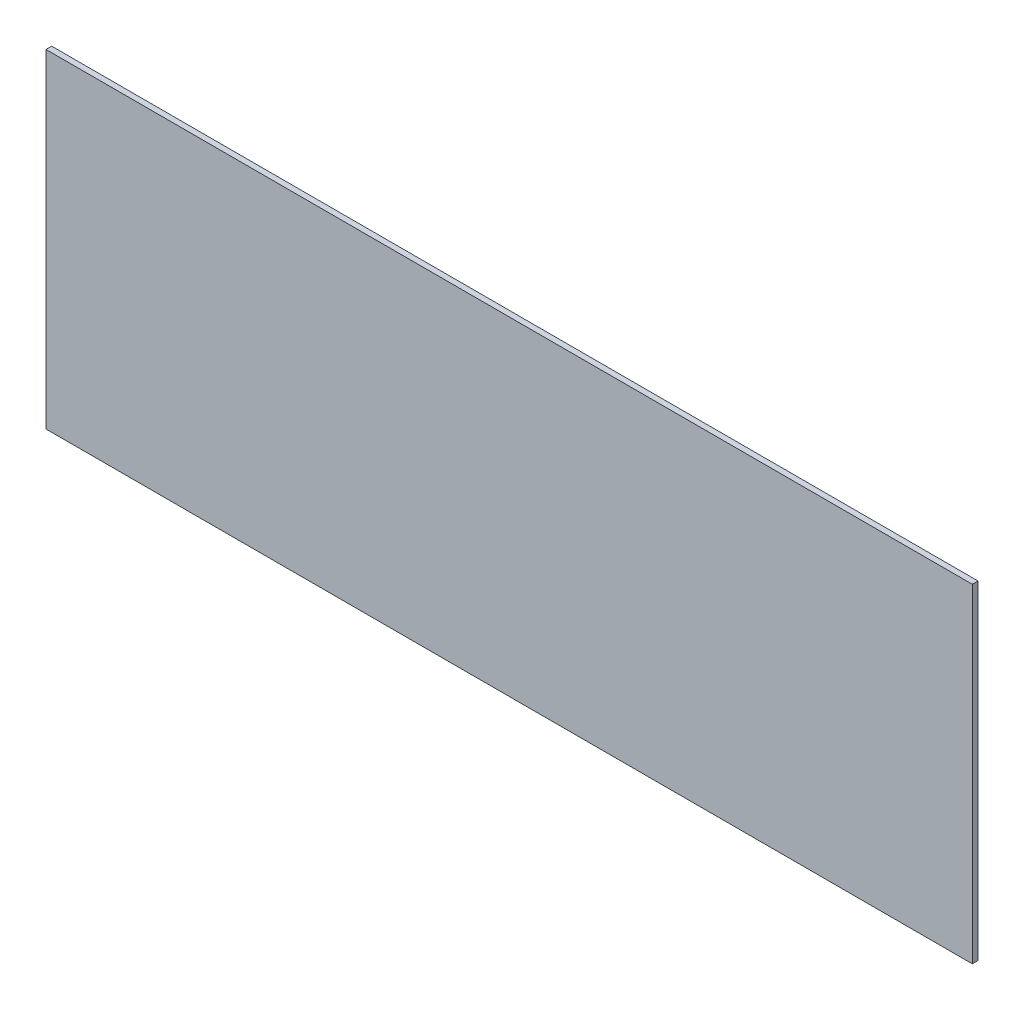
ISO-10303-21;
HEADER;
FILE_DESCRIPTION(('STEP AP214'),'2;1');
FILE_NAME('part.step','',(''),(''),'','','');
FILE_SCHEMA(('AUTOMOTIVE_DESIGN { 1 0 10303 214 1 1 1 1 }'));
ENDSEC;
DATA;
#1=APPLICATION_CONTEXT('core data for automotive mechanical design processes');
#2=APPLICATION_PROTOCOL_DEFINITION('international standard','automotive_design',2000,#1);
#3=PRODUCT_CONTEXT('',#1,'mechanical');
#4=PRODUCT('Part','Part','',(#3));
#5=PRODUCT_RELATED_PRODUCT_CATEGORY('part','',(#4));
#6=PRODUCT_DEFINITION_FORMATION('','',#4);
#7=PRODUCT_DEFINITION_CONTEXT('part definition',#1,'design');
#8=PRODUCT_DEFINITION('design','',#6,#7);
#9=PRODUCT_DEFINITION_SHAPE('','',#8);
#10=(LENGTH_UNIT() NAMED_UNIT(*) SI_UNIT(.MILLI.,.METRE.));
#11=(NAMED_UNIT(*) PLANE_ANGLE_UNIT() SI_UNIT($,.RADIAN.));
#12=(NAMED_UNIT(*) SI_UNIT($,.STERADIAN.) SOLID_ANGLE_UNIT());
#13=UNCERTAINTY_MEASURE_WITH_UNIT(LENGTH_MEASURE(1.E-05),#10,'distance_accuracy_value','');
#14=(GEOMETRIC_REPRESENTATION_CONTEXT(3) GLOBAL_UNCERTAINTY_ASSIGNED_CONTEXT((#13)) GLOBAL_UNIT_ASSIGNED_CONTEXT((#10,
#11,#12)) REPRESENTATION_CONTEXT('',''));
#15=CARTESIAN_POINT('',(0.,0.,0.));
#16=DIRECTION('',(0.,0.,1.));
#17=DIRECTION('',(1.,0.,0.));
#18=AXIS2_PLACEMENT_3D('',#15,#16,#17);
#19=CARTESIAN_POINT('',(162.024,0.,1.));
#20=DIRECTION('',(0.,1.,0.));
#21=DIRECTION('',(-1.,0.,0.));
#22=AXIS2_PLACEMENT_3D('',#19,#20,#21);
#23=PLANE('',#22);
#24=DIRECTION('',(1.,0.,0.));
#25=VECTOR('',#24,1.);
#26=CARTESIAN_POINT('',(162.024,0.,0.));
#27=LINE('',#26,#25);
#28=CARTESIAN_POINT('',(0.,0.,0.));
#29=VERTEX_POINT('',#28);
#30=CARTESIAN_POINT('',(162.024,0.,0.));
#31=VERTEX_POINT('',#30);
#32=EDGE_CURVE('E96',#29,#31,#27,.T.);
#33=ORIENTED_EDGE('',*,*,#32,.T.);
#34=DIRECTION('',(0.,0.,-1.));
#35=VECTOR('',#34,1.);
#36=CARTESIAN_POINT('',(162.024,0.,1.));
#37=LINE('',#36,#35);
#38=CARTESIAN_POINT('',(162.024,0.,1.));
#39=VERTEX_POINT('',#38);
#40=EDGE_CURVE('E11',#39,#31,#37,.T.);
#41=ORIENTED_EDGE('',*,*,#40,.F.);
#42=DIRECTION('',(1.,0.,0.));
#43=VECTOR('',#42,1.);
#44=CARTESIAN_POINT('',(162.024,0.,1.));
#45=LINE('',#44,#43);
#46=CARTESIAN_POINT('',(0.,0.,1.));
#47=VERTEX_POINT('',#46);
#48=EDGE_CURVE('E84',#47,#39,#45,.T.);
#49=ORIENTED_EDGE('',*,*,#48,.F.);
#50=DIRECTION('',(0.,0.,-1.));
#51=VECTOR('',#50,1.);
#52=CARTESIAN_POINT('',(0.,0.,1.));
#53=LINE('',#52,#51);
#54=EDGE_CURVE('E92',#47,#29,#53,.T.);
#55=ORIENTED_EDGE('',*,*,#54,.T.);
#56=EDGE_LOOP('',(#33,#41,#49,#55));
#57=FACE_BOUND('',#56,.T.);
#58=ADVANCED_FACE('F33',(#57),#23,.F.);
#59=CARTESIAN_POINT('',(162.024,57.5,1.));
#60=DIRECTION('',(-1.,0.,0.));
#61=DIRECTION('',(0.,0.,1.));
#62=AXIS2_PLACEMENT_3D('',#59,#60,#61);
#63=PLANE('',#62);
#64=DIRECTION('',(0.,1.,0.));
#65=VECTOR('',#64,1.);
#66=CARTESIAN_POINT('',(162.024,57.5,0.));
#67=LINE('',#66,#65);
#68=CARTESIAN_POINT('',(162.024,57.5,0.));
#69=VERTEX_POINT('',#68);
#70=EDGE_CURVE('E88',#31,#69,#67,.T.);
#71=ORIENTED_EDGE('',*,*,#70,.T.);
#72=DIRECTION('',(0.,0.,-1.));
#73=VECTOR('',#72,1.);
#74=CARTESIAN_POINT('',(162.024,57.5,1.));
#75=LINE('',#74,#73);
#76=CARTESIAN_POINT('',(162.024,57.5,1.));
#77=VERTEX_POINT('',#76);
#78=EDGE_CURVE('E41',#77,#69,#75,.T.);
#79=ORIENTED_EDGE('',*,*,#78,.F.);
#80=DIRECTION('',(0.,1.,0.));
#81=VECTOR('',#80,1.);
#82=CARTESIAN_POINT('',(162.024,57.5,1.));
#83=LINE('',#82,#81);
#84=EDGE_CURVE('E79',#39,#77,#83,.T.);
#85=ORIENTED_EDGE('',*,*,#84,.F.);
#86=ORIENTED_EDGE('',*,*,#40,.T.);
#87=EDGE_LOOP('',(#71,#79,#85,#86));
#88=FACE_BOUND('',#87,.T.);
#89=ADVANCED_FACE('F87',(#88),#63,.F.);
#90=CARTESIAN_POINT('',(0.,57.5,1.));
#91=DIRECTION('',(0.,-1.,0.));
#92=DIRECTION('',(0.,0.,-1.));
#93=AXIS2_PLACEMENT_3D('',#90,#91,#92);
#94=PLANE('',#93);
#95=DIRECTION('',(-1.,0.,0.));
#96=VECTOR('',#95,1.);
#97=CARTESIAN_POINT('',(0.,57.5,0.));
#98=LINE('',#97,#96);
#99=CARTESIAN_POINT('',(0.,57.5,0.));
#100=VERTEX_POINT('',#99);
#101=EDGE_CURVE('E66',#69,#100,#98,.T.);
#102=ORIENTED_EDGE('',*,*,#101,.T.);
#103=DIRECTION('',(0.,0.,-1.));
#104=VECTOR('',#103,1.);
#105=CARTESIAN_POINT('',(0.,57.5,1.));
#106=LINE('',#105,#104);
#107=CARTESIAN_POINT('',(0.,57.5,1.));
#108=VERTEX_POINT('',#107);
#109=EDGE_CURVE('E89',#108,#100,#106,.T.);
#110=ORIENTED_EDGE('',*,*,#109,.F.);
#111=DIRECTION('',(-1.,0.,0.));
#112=VECTOR('',#111,1.);
#113=CARTESIAN_POINT('',(0.,57.5,1.));
#114=LINE('',#113,#112);
#115=EDGE_CURVE('E82',#77,#108,#114,.T.);
#116=ORIENTED_EDGE('',*,*,#115,.F.);
#117=ORIENTED_EDGE('',*,*,#78,.T.);
#118=EDGE_LOOP('',(#102,#110,#116,#117));
#119=FACE_BOUND('',#118,.T.);
#120=ADVANCED_FACE('F90',(#119),#94,.F.);
#121=CARTESIAN_POINT('',(0.,0.,1.));
#122=DIRECTION('',(1.,0.,0.));
#123=DIRECTION('',(0.,0.,-1.));
#124=AXIS2_PLACEMENT_3D('',#121,#122,#123);
#125=PLANE('',#124);
#126=DIRECTION('',(0.,-1.,0.));
#127=VECTOR('',#126,1.);
#128=CARTESIAN_POINT('',(0.,0.,0.));
#129=LINE('',#128,#127);
#130=EDGE_CURVE('E72',#100,#29,#129,.T.);
#131=ORIENTED_EDGE('',*,*,#130,.T.);
#132=ORIENTED_EDGE('',*,*,#54,.F.);
#133=DIRECTION('',(0.,-1.,0.));
#134=VECTOR('',#133,1.);
#135=CARTESIAN_POINT('',(0.,0.,1.));
#136=LINE('',#135,#134);
#137=EDGE_CURVE('E49',#108,#47,#136,.T.);
#138=ORIENTED_EDGE('',*,*,#137,.F.);
#139=ORIENTED_EDGE('',*,*,#109,.T.);
#140=EDGE_LOOP('',(#131,#132,#138,#139));
#141=FACE_BOUND('',#140,.T.);
#142=ADVANCED_FACE('F103',(#141),#125,.F.);
#143=CARTESIAN_POINT('',(0.,0.,1.));
#144=DIRECTION('',(0.,0.,-1.));
#145=DIRECTION('',(-1.,0.,0.));
#146=AXIS2_PLACEMENT_3D('',#143,#144,#145);
#147=PLANE('',#146);
#148=ORIENTED_EDGE('',*,*,#48,.T.);
#149=ORIENTED_EDGE('',*,*,#84,.T.);
#150=ORIENTED_EDGE('',*,*,#115,.T.);
#151=ORIENTED_EDGE('',*,*,#137,.T.);
#152=EDGE_LOOP('',(#148,#149,#150,#151));
#153=FACE_BOUND('',#152,.T.);
#154=ADVANCED_FACE('F80',(#153),#147,.F.);
#155=CARTESIAN_POINT('',(0.,0.,0.));
#156=DIRECTION('',(0.,0.,-1.));
#157=DIRECTION('',(-1.,0.,0.));
#158=AXIS2_PLACEMENT_3D('',#155,#156,#157);
#159=PLANE('',#158);
#160=ORIENTED_EDGE('',*,*,#32,.F.);
#161=ORIENTED_EDGE('',*,*,#130,.F.);
#162=ORIENTED_EDGE('',*,*,#101,.F.);
#163=ORIENTED_EDGE('',*,*,#70,.F.);
#164=EDGE_LOOP('',(#160,#161,#162,#163));
#165=FACE_BOUND('',#164,.T.);
#166=ADVANCED_FACE('F106',(#165),#159,.T.);
#167=CLOSED_SHELL('',(#58,#89,#120,#142,#154,#166));
#168=MANIFOLD_SOLID_BREP('B2',#167);
#169=ADVANCED_BREP_SHAPE_REPRESENTATION('',(#18,#168),#14);
#170=SHAPE_DEFINITION_REPRESENTATION(#9,#169);
ENDSEC;
END-ISO-10303-21;
